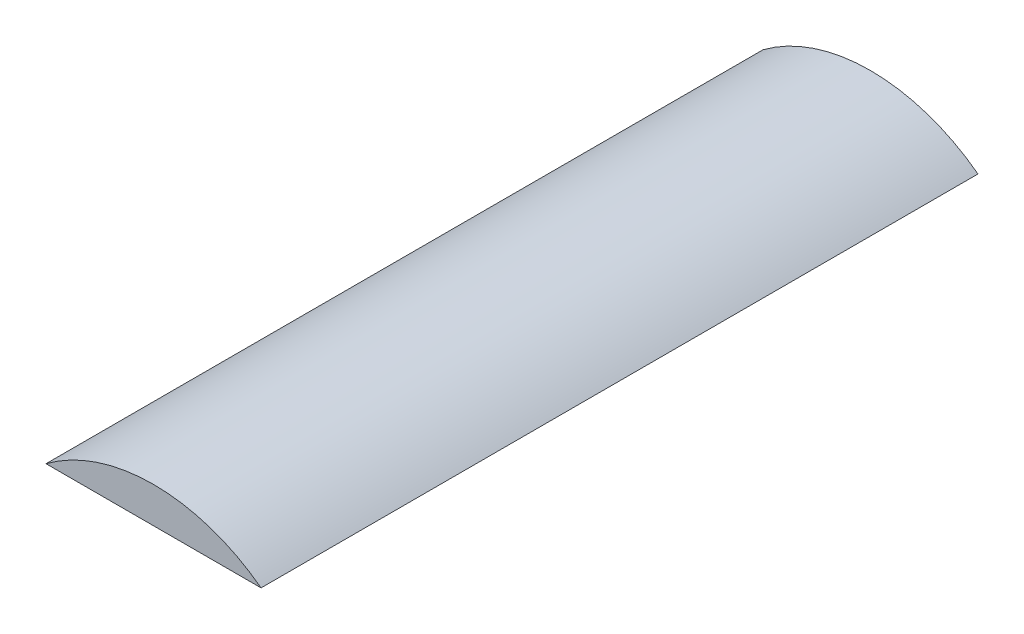
ISO-10303-21;
HEADER;
FILE_DESCRIPTION(('STEP AP214'),'2;1');
FILE_NAME('part.step','',(''),(''),'','','');
FILE_SCHEMA(('AUTOMOTIVE_DESIGN { 1 0 10303 214 1 1 1 1 }'));
ENDSEC;
DATA;
#1=APPLICATION_CONTEXT('core data for automotive mechanical design processes');
#2=APPLICATION_PROTOCOL_DEFINITION('international standard','automotive_design',2000,#1);
#3=PRODUCT_CONTEXT('',#1,'mechanical');
#4=PRODUCT('Part','Part','',(#3));
#5=PRODUCT_RELATED_PRODUCT_CATEGORY('part','',(#4));
#6=PRODUCT_DEFINITION_FORMATION('','',#4);
#7=PRODUCT_DEFINITION_CONTEXT('part definition',#1,'design');
#8=PRODUCT_DEFINITION('design','',#6,#7);
#9=PRODUCT_DEFINITION_SHAPE('','',#8);
#10=(LENGTH_UNIT() NAMED_UNIT(*) SI_UNIT(.MILLI.,.METRE.));
#11=(NAMED_UNIT(*) PLANE_ANGLE_UNIT() SI_UNIT($,.RADIAN.));
#12=(NAMED_UNIT(*) SI_UNIT($,.STERADIAN.) SOLID_ANGLE_UNIT());
#13=UNCERTAINTY_MEASURE_WITH_UNIT(LENGTH_MEASURE(1.E-05),#10,'distance_accuracy_value','');
#14=(GEOMETRIC_REPRESENTATION_CONTEXT(3) GLOBAL_UNCERTAINTY_ASSIGNED_CONTEXT((#13)) GLOBAL_UNIT_ASSIGNED_CONTEXT((#10,
#11,#12)) REPRESENTATION_CONTEXT('',''));
#15=CARTESIAN_POINT('',(0.,0.,0.));
#16=DIRECTION('',(0.,0.,1.));
#17=DIRECTION('',(1.,0.,0.));
#18=AXIS2_PLACEMENT_3D('',#15,#16,#17);
#19=CARTESIAN_POINT('',(0.,0.,10.));
#20=DIRECTION('',(0.,0.,-1.));
#21=DIRECTION('',(-1.,0.,0.));
#22=AXIS2_PLACEMENT_3D('',#19,#20,#21);
#23=CYLINDRICAL_SURFACE('',#22,2.5);
#24=CARTESIAN_POINT('',(0.,0.,0.));
#25=DIRECTION('',(0.,0.,1.));
#26=DIRECTION('',(1.,0.,0.));
#27=AXIS2_PLACEMENT_3D('',#24,#25,#26);
#28=CIRCLE('',#27,2.5);
#29=CARTESIAN_POINT('',(1.5,2.,0.));
#30=VERTEX_POINT('',#29);
#31=CARTESIAN_POINT('',(-1.5,2.,0.));
#32=VERTEX_POINT('',#31);
#33=EDGE_CURVE('E78',#30,#32,#28,.T.);
#34=ORIENTED_EDGE('',*,*,#33,.T.);
#35=DIRECTION('',(0.,0.,-1.));
#36=VECTOR('',#35,1.);
#37=CARTESIAN_POINT('',(-1.5,2.,10.));
#38=LINE('',#37,#36);
#39=CARTESIAN_POINT('',(-1.5,2.,10.));
#40=VERTEX_POINT('',#39);
#41=EDGE_CURVE('E11',#40,#32,#38,.T.);
#42=ORIENTED_EDGE('',*,*,#41,.F.);
#43=CARTESIAN_POINT('',(0.,0.,10.));
#44=DIRECTION('',(0.,0.,1.));
#45=DIRECTION('',(1.,0.,0.));
#46=AXIS2_PLACEMENT_3D('',#43,#44,#45);
#47=CIRCLE('',#46,2.5);
#48=CARTESIAN_POINT('',(1.5,2.,10.));
#49=VERTEX_POINT('',#48);
#50=EDGE_CURVE('E77',#49,#40,#47,.T.);
#51=ORIENTED_EDGE('',*,*,#50,.F.);
#52=DIRECTION('',(0.,0.,-1.));
#53=VECTOR('',#52,1.);
#54=CARTESIAN_POINT('',(1.5,2.,10.));
#55=LINE('',#54,#53);
#56=EDGE_CURVE('E54',#49,#30,#55,.T.);
#57=ORIENTED_EDGE('',*,*,#56,.T.);
#58=EDGE_LOOP('',(#34,#42,#51,#57));
#59=FACE_BOUND('',#58,.T.);
#60=ADVANCED_FACE('F45',(#59),#23,.T.);
#61=CARTESIAN_POINT('',(-1.5,2.,10.));
#62=DIRECTION('',(0.,1.,0.));
#63=DIRECTION('',(-1.,0.,0.));
#64=AXIS2_PLACEMENT_3D('',#61,#62,#63);
#65=PLANE('',#64);
#66=DIRECTION('',(1.,0.,0.));
#67=VECTOR('',#66,1.);
#68=CARTESIAN_POINT('',(-1.5,2.,0.));
#69=LINE('',#68,#67);
#70=EDGE_CURVE('E69',#32,#30,#69,.T.);
#71=ORIENTED_EDGE('',*,*,#70,.T.);
#72=ORIENTED_EDGE('',*,*,#56,.F.);
#73=DIRECTION('',(1.,0.,0.));
#74=VECTOR('',#73,1.);
#75=CARTESIAN_POINT('',(-1.5,2.,10.));
#76=LINE('',#75,#74);
#77=EDGE_CURVE('E61',#40,#49,#76,.T.);
#78=ORIENTED_EDGE('',*,*,#77,.F.);
#79=ORIENTED_EDGE('',*,*,#41,.T.);
#80=EDGE_LOOP('',(#71,#72,#78,#79));
#81=FACE_BOUND('',#80,.T.);
#82=ADVANCED_FACE('F72',(#81),#65,.F.);
#83=CARTESIAN_POINT('',(0.,0.,10.));
#84=DIRECTION('',(0.,0.,1.));
#85=DIRECTION('',(1.,0.,0.));
#86=AXIS2_PLACEMENT_3D('',#83,#84,#85);
#87=PLANE('',#86);
#88=ORIENTED_EDGE('',*,*,#50,.T.);
#89=ORIENTED_EDGE('',*,*,#77,.T.);
#90=EDGE_LOOP('',(#88,#89));
#91=FACE_BOUND('',#90,.T.);
#92=ADVANCED_FACE('F89',(#91),#87,.T.);
#93=CARTESIAN_POINT('',(0.,0.,0.));
#94=DIRECTION('',(0.,0.,1.));
#95=DIRECTION('',(1.,0.,0.));
#96=AXIS2_PLACEMENT_3D('',#93,#94,#95);
#97=PLANE('',#96);
#98=ORIENTED_EDGE('',*,*,#33,.F.);
#99=ORIENTED_EDGE('',*,*,#70,.F.);
#100=EDGE_LOOP('',(#98,#99));
#101=FACE_BOUND('',#100,.T.);
#102=ADVANCED_FACE('F82',(#101),#97,.F.);
#103=CLOSED_SHELL('',(#60,#82,#92,#102));
#104=MANIFOLD_SOLID_BREP('B2',#103);
#105=ADVANCED_BREP_SHAPE_REPRESENTATION('',(#18,#104),#14);
#106=SHAPE_DEFINITION_REPRESENTATION(#9,#105);
ENDSEC;
END-ISO-10303-21;
